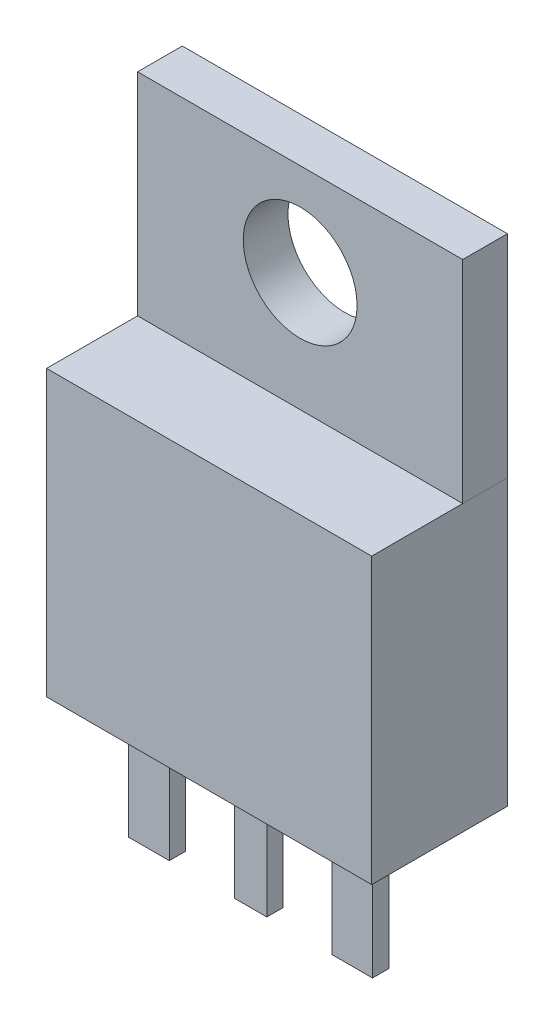
ISO-10303-21;
HEADER;
FILE_DESCRIPTION(('STEP AP214'),'2;1');
FILE_NAME('part.step','',(''),(''),'','','');
FILE_SCHEMA(('AUTOMOTIVE_DESIGN { 1 0 10303 214 1 1 1 1 }'));
ENDSEC;
DATA;
#1=APPLICATION_CONTEXT('core data for automotive mechanical design processes');
#2=APPLICATION_PROTOCOL_DEFINITION('international standard','automotive_design',2000,#1);
#3=PRODUCT_CONTEXT('',#1,'mechanical');
#4=PRODUCT('Part','Part','',(#3));
#5=PRODUCT_RELATED_PRODUCT_CATEGORY('part','',(#4));
#6=PRODUCT_DEFINITION_FORMATION('','',#4);
#7=PRODUCT_DEFINITION_CONTEXT('part definition',#1,'design');
#8=PRODUCT_DEFINITION('design','',#6,#7);
#9=PRODUCT_DEFINITION_SHAPE('','',#8);
#10=(LENGTH_UNIT() NAMED_UNIT(*) SI_UNIT(.MILLI.,.METRE.));
#11=(NAMED_UNIT(*) PLANE_ANGLE_UNIT() SI_UNIT($,.RADIAN.));
#12=(NAMED_UNIT(*) SI_UNIT($,.STERADIAN.) SOLID_ANGLE_UNIT());
#13=UNCERTAINTY_MEASURE_WITH_UNIT(LENGTH_MEASURE(1.E-05),#10,'distance_accuracy_value','');
#14=(GEOMETRIC_REPRESENTATION_CONTEXT(3) GLOBAL_UNCERTAINTY_ASSIGNED_CONTEXT((#13)) GLOBAL_UNIT_ASSIGNED_CONTEXT((#10,
#11,#12)) REPRESENTATION_CONTEXT('',''));
#15=CARTESIAN_POINT('',(0.,0.,0.));
#16=DIRECTION('',(0.,0.,1.));
#17=DIRECTION('',(1.,0.,0.));
#18=AXIS2_PLACEMENT_3D('',#15,#16,#17);
#19=CARTESIAN_POINT('',(0.508000000000001,-16.002,2.9464));
#20=DIRECTION('',(-1.,0.,0.));
#21=DIRECTION('',(0.,0.,1.));
#22=AXIS2_PLACEMENT_3D('',#19,#20,#21);
#23=PLANE('',#22);
#24=DIRECTION('',(0.,0.,1.));
#25=VECTOR('',#24,1.);
#26=CARTESIAN_POINT('',(0.508000000000001,-12.192,2.9464));
#27=LINE('',#26,#25);
#28=CARTESIAN_POINT('',(0.508000000000001,-12.192,2.4384));
#29=VERTEX_POINT('',#28);
#30=CARTESIAN_POINT('',(0.508000000000001,-12.192,2.9464));
#31=VERTEX_POINT('',#30);
#32=EDGE_CURVE('E111',#29,#31,#27,.T.);
#33=ORIENTED_EDGE('',*,*,#32,.T.);
#34=DIRECTION('',(0.,1.,0.));
#35=VECTOR('',#34,1.);
#36=CARTESIAN_POINT('',(0.508000000000001,-16.002,2.9464));
#37=LINE('',#36,#35);
#38=CARTESIAN_POINT('',(0.508000000000001,-16.002,2.9464));
#39=VERTEX_POINT('',#38);
#40=EDGE_CURVE('E12',#39,#31,#37,.T.);
#41=ORIENTED_EDGE('',*,*,#40,.F.);
#42=DIRECTION('',(0.,0.,1.));
#43=VECTOR('',#42,1.);
#44=CARTESIAN_POINT('',(0.508000000000001,-16.002,2.9464));
#45=LINE('',#44,#43);
#46=CARTESIAN_POINT('',(0.508000000000001,-16.002,2.4384));
#47=VERTEX_POINT('',#46);
#48=EDGE_CURVE('E99',#47,#39,#45,.T.);
#49=ORIENTED_EDGE('',*,*,#48,.F.);
#50=DIRECTION('',(0.,1.,0.));
#51=VECTOR('',#50,1.);
#52=CARTESIAN_POINT('',(0.508000000000001,-16.002,2.4384));
#53=LINE('',#52,#51);
#54=EDGE_CURVE('E107',#47,#29,#53,.T.);
#55=ORIENTED_EDGE('',*,*,#54,.T.);
#56=EDGE_LOOP('',(#33,#41,#49,#55));
#57=FACE_BOUND('',#56,.T.);
#58=ADVANCED_FACE('F48',(#57),#23,.F.);
#59=CARTESIAN_POINT('',(-0.507999999999999,-16.002,2.9464));
#60=DIRECTION('',(0.,0.,-1.));
#61=DIRECTION('',(-1.,0.,0.));
#62=AXIS2_PLACEMENT_3D('',#59,#60,#61);
#63=PLANE('',#62);
#64=DIRECTION('',(-1.,0.,0.));
#65=VECTOR('',#64,1.);
#66=CARTESIAN_POINT('',(-0.507999999999999,-12.192,2.9464));
#67=LINE('',#66,#65);
#68=CARTESIAN_POINT('',(-0.507999999999999,-12.192,2.9464));
#69=VERTEX_POINT('',#68);
#70=EDGE_CURVE('E103',#31,#69,#67,.T.);
#71=ORIENTED_EDGE('',*,*,#70,.T.);
#72=DIRECTION('',(0.,1.,0.));
#73=VECTOR('',#72,1.);
#74=CARTESIAN_POINT('',(-0.507999999999999,-16.002,2.9464));
#75=LINE('',#74,#73);
#76=CARTESIAN_POINT('',(-0.507999999999999,-16.002,2.9464));
#77=VERTEX_POINT('',#76);
#78=EDGE_CURVE('E56',#77,#69,#75,.T.);
#79=ORIENTED_EDGE('',*,*,#78,.F.);
#80=DIRECTION('',(-1.,0.,0.));
#81=VECTOR('',#80,1.);
#82=CARTESIAN_POINT('',(-0.507999999999999,-16.002,2.9464));
#83=LINE('',#82,#81);
#84=EDGE_CURVE('E94',#39,#77,#83,.T.);
#85=ORIENTED_EDGE('',*,*,#84,.F.);
#86=ORIENTED_EDGE('',*,*,#40,.T.);
#87=EDGE_LOOP('',(#71,#79,#85,#86));
#88=FACE_BOUND('',#87,.T.);
#89=ADVANCED_FACE('F102',(#88),#63,.F.);
#90=CARTESIAN_POINT('',(-0.507999999999999,-16.002,2.9464));
#91=DIRECTION('',(1.,0.,0.));
#92=DIRECTION('',(0.,0.,-1.));
#93=AXIS2_PLACEMENT_3D('',#90,#91,#92);
#94=PLANE('',#93);
#95=DIRECTION('',(0.,0.,-1.));
#96=VECTOR('',#95,1.);
#97=CARTESIAN_POINT('',(-0.507999999999999,-12.192,2.9464));
#98=LINE('',#97,#96);
#99=CARTESIAN_POINT('',(-0.507999999999999,-12.192,2.4384));
#100=VERTEX_POINT('',#99);
#101=EDGE_CURVE('E81',#69,#100,#98,.T.);
#102=ORIENTED_EDGE('',*,*,#101,.T.);
#103=DIRECTION('',(0.,1.,0.));
#104=VECTOR('',#103,1.);
#105=CARTESIAN_POINT('',(-0.507999999999999,-16.002,2.4384));
#106=LINE('',#105,#104);
#107=CARTESIAN_POINT('',(-0.507999999999999,-16.002,2.4384));
#108=VERTEX_POINT('',#107);
#109=EDGE_CURVE('E104',#108,#100,#106,.T.);
#110=ORIENTED_EDGE('',*,*,#109,.F.);
#111=DIRECTION('',(0.,0.,-1.));
#112=VECTOR('',#111,1.);
#113=CARTESIAN_POINT('',(-0.507999999999999,-16.002,2.9464));
#114=LINE('',#113,#112);
#115=EDGE_CURVE('E97',#77,#108,#114,.T.);
#116=ORIENTED_EDGE('',*,*,#115,.F.);
#117=ORIENTED_EDGE('',*,*,#78,.T.);
#118=EDGE_LOOP('',(#102,#110,#116,#117));
#119=FACE_BOUND('',#118,.T.);
#120=ADVANCED_FACE('F105',(#119),#94,.F.);
#121=CARTESIAN_POINT('',(-0.507999999999999,-16.002,2.4384));
#122=DIRECTION('',(0.,0.,1.));
#123=DIRECTION('',(1.,0.,0.));
#124=AXIS2_PLACEMENT_3D('',#121,#122,#123);
#125=PLANE('',#124);
#126=DIRECTION('',(1.,0.,0.));
#127=VECTOR('',#126,1.);
#128=CARTESIAN_POINT('',(-0.507999999999999,-12.192,2.4384));
#129=LINE('',#128,#127);
#130=EDGE_CURVE('E87',#100,#29,#129,.T.);
#131=ORIENTED_EDGE('',*,*,#130,.T.);
#132=ORIENTED_EDGE('',*,*,#54,.F.);
#133=DIRECTION('',(1.,0.,0.));
#134=VECTOR('',#133,1.);
#135=CARTESIAN_POINT('',(-0.507999999999999,-16.002,2.4384));
#136=LINE('',#135,#134);
#137=EDGE_CURVE('E64',#108,#47,#136,.T.);
#138=ORIENTED_EDGE('',*,*,#137,.F.);
#139=ORIENTED_EDGE('',*,*,#109,.T.);
#140=EDGE_LOOP('',(#131,#132,#138,#139));
#141=FACE_BOUND('',#140,.T.);
#142=ADVANCED_FACE('F118',(#141),#125,.F.);
#143=CARTESIAN_POINT('',(0.,-16.002,0.));
#144=DIRECTION('',(0.,-1.,0.));
#145=DIRECTION('',(0.,0.,-1.));
#146=AXIS2_PLACEMENT_3D('',#143,#144,#145);
#147=PLANE('',#146);
#148=ORIENTED_EDGE('',*,*,#48,.T.);
#149=ORIENTED_EDGE('',*,*,#84,.T.);
#150=ORIENTED_EDGE('',*,*,#115,.T.);
#151=ORIENTED_EDGE('',*,*,#137,.T.);
#152=EDGE_LOOP('',(#148,#149,#150,#151));
#153=FACE_BOUND('',#152,.T.);
#154=ADVANCED_FACE('F95',(#153),#147,.T.);
#155=CARTESIAN_POINT('',(0.,-12.192,0.));
#156=DIRECTION('',(0.,-1.,0.));
#157=DIRECTION('',(0.,0.,-1.));
#158=AXIS2_PLACEMENT_3D('',#155,#156,#157);
#159=PLANE('',#158);
#160=ORIENTED_EDGE('',*,*,#32,.F.);
#161=ORIENTED_EDGE('',*,*,#130,.F.);
#162=ORIENTED_EDGE('',*,*,#101,.F.);
#163=ORIENTED_EDGE('',*,*,#70,.F.);
#164=EDGE_LOOP('',(#160,#161,#162,#163));
#165=FACE_BOUND('',#164,.T.);
#166=ADVANCED_FACE('F121',(#165),#159,.F.);
#167=CLOSED_SHELL('',(#58,#89,#120,#142,#154,#166));
#168=MANIFOLD_SOLID_BREP('B2',#167);
#169=CARTESIAN_POINT('',(3.81,-16.002,2.9464));
#170=DIRECTION('',(-1.,0.,0.));
#171=DIRECTION('',(0.,0.,1.));
#172=AXIS2_PLACEMENT_3D('',#169,#170,#171);
#173=PLANE('',#172);
#174=DIRECTION('',(0.,0.,1.));
#175=VECTOR('',#174,1.);
#176=CARTESIAN_POINT('',(3.81,-12.192,2.9464));
#177=LINE('',#176,#175);
#178=CARTESIAN_POINT('',(3.81,-12.192,2.4384));
#179=VERTEX_POINT('',#178);
#180=CARTESIAN_POINT('',(3.81,-12.192,2.9464));
#181=VERTEX_POINT('',#180);
#182=EDGE_CURVE('E245',#179,#181,#177,.T.);
#183=ORIENTED_EDGE('',*,*,#182,.T.);
#184=DIRECTION('',(0.,1.,0.));
#185=VECTOR('',#184,1.);
#186=CARTESIAN_POINT('',(3.81,-16.002,2.9464));
#187=LINE('',#186,#185);
#188=CARTESIAN_POINT('',(3.81,-16.002,2.9464));
#189=VERTEX_POINT('',#188);
#190=EDGE_CURVE('E46',#189,#181,#187,.T.);
#191=ORIENTED_EDGE('',*,*,#190,.F.);
#192=DIRECTION('',(0.,0.,1.));
#193=VECTOR('',#192,1.);
#194=CARTESIAN_POINT('',(3.81,-16.002,2.9464));
#195=LINE('',#194,#193);
#196=CARTESIAN_POINT('',(3.81,-16.002,2.4384));
#197=VERTEX_POINT('',#196);
#198=EDGE_CURVE('E233',#197,#189,#195,.T.);
#199=ORIENTED_EDGE('',*,*,#198,.F.);
#200=DIRECTION('',(0.,1.,0.));
#201=VECTOR('',#200,1.);
#202=CARTESIAN_POINT('',(3.81,-16.002,2.4384));
#203=LINE('',#202,#201);
#204=EDGE_CURVE('E241',#197,#179,#203,.T.);
#205=ORIENTED_EDGE('',*,*,#204,.T.);
#206=EDGE_LOOP('',(#183,#191,#199,#205));
#207=FACE_BOUND('',#206,.T.);
#208=ADVANCED_FACE('F182',(#207),#173,.F.);
#209=CARTESIAN_POINT('',(2.54,-16.002,2.9464));
#210=DIRECTION('',(0.,0.,-1.));
#211=DIRECTION('',(-1.,0.,0.));
#212=AXIS2_PLACEMENT_3D('',#209,#210,#211);
#213=PLANE('',#212);
#214=DIRECTION('',(-1.,0.,0.));
#215=VECTOR('',#214,1.);
#216=CARTESIAN_POINT('',(2.54,-12.192,2.9464));
#217=LINE('',#216,#215);
#218=CARTESIAN_POINT('',(2.54,-12.192,2.9464));
#219=VERTEX_POINT('',#218);
#220=EDGE_CURVE('E237',#181,#219,#217,.T.);
#221=ORIENTED_EDGE('',*,*,#220,.T.);
#222=DIRECTION('',(0.,1.,0.));
#223=VECTOR('',#222,1.);
#224=CARTESIAN_POINT('',(2.54,-16.002,2.9464));
#225=LINE('',#224,#223);
#226=CARTESIAN_POINT('',(2.54,-16.002,2.9464));
#227=VERTEX_POINT('',#226);
#228=EDGE_CURVE('E190',#227,#219,#225,.T.);
#229=ORIENTED_EDGE('',*,*,#228,.F.);
#230=DIRECTION('',(-1.,0.,0.));
#231=VECTOR('',#230,1.);
#232=CARTESIAN_POINT('',(2.54,-16.002,2.9464));
#233=LINE('',#232,#231);
#234=EDGE_CURVE('E228',#189,#227,#233,.T.);
#235=ORIENTED_EDGE('',*,*,#234,.F.);
#236=ORIENTED_EDGE('',*,*,#190,.T.);
#237=EDGE_LOOP('',(#221,#229,#235,#236));
#238=FACE_BOUND('',#237,.T.);
#239=ADVANCED_FACE('F236',(#238),#213,.F.);
#240=CARTESIAN_POINT('',(2.54,-16.002,2.9464));
#241=DIRECTION('',(1.,0.,0.));
#242=DIRECTION('',(0.,0.,-1.));
#243=AXIS2_PLACEMENT_3D('',#240,#241,#242);
#244=PLANE('',#243);
#245=DIRECTION('',(0.,0.,-1.));
#246=VECTOR('',#245,1.);
#247=CARTESIAN_POINT('',(2.54,-12.192,2.9464));
#248=LINE('',#247,#246);
#249=CARTESIAN_POINT('',(2.54,-12.192,2.4384));
#250=VERTEX_POINT('',#249);
#251=EDGE_CURVE('E215',#219,#250,#248,.T.);
#252=ORIENTED_EDGE('',*,*,#251,.T.);
#253=DIRECTION('',(0.,1.,0.));
#254=VECTOR('',#253,1.);
#255=CARTESIAN_POINT('',(2.54,-16.002,2.4384));
#256=LINE('',#255,#254);
#257=CARTESIAN_POINT('',(2.54,-16.002,2.4384));
#258=VERTEX_POINT('',#257);
#259=EDGE_CURVE('E238',#258,#250,#256,.T.);
#260=ORIENTED_EDGE('',*,*,#259,.F.);
#261=DIRECTION('',(0.,0.,-1.));
#262=VECTOR('',#261,1.);
#263=CARTESIAN_POINT('',(2.54,-16.002,2.9464));
#264=LINE('',#263,#262);
#265=EDGE_CURVE('E231',#227,#258,#264,.T.);
#266=ORIENTED_EDGE('',*,*,#265,.F.);
#267=ORIENTED_EDGE('',*,*,#228,.T.);
#268=EDGE_LOOP('',(#252,#260,#266,#267));
#269=FACE_BOUND('',#268,.T.);
#270=ADVANCED_FACE('F239',(#269),#244,.F.);
#271=CARTESIAN_POINT('',(2.54,-16.002,2.4384));
#272=DIRECTION('',(0.,0.,1.));
#273=DIRECTION('',(1.,0.,0.));
#274=AXIS2_PLACEMENT_3D('',#271,#272,#273);
#275=PLANE('',#274);
#276=DIRECTION('',(1.,0.,0.));
#277=VECTOR('',#276,1.);
#278=CARTESIAN_POINT('',(2.54,-12.192,2.4384));
#279=LINE('',#278,#277);
#280=EDGE_CURVE('E221',#250,#179,#279,.T.);
#281=ORIENTED_EDGE('',*,*,#280,.T.);
#282=ORIENTED_EDGE('',*,*,#204,.F.);
#283=DIRECTION('',(1.,0.,0.));
#284=VECTOR('',#283,1.);
#285=CARTESIAN_POINT('',(2.54,-16.002,2.4384));
#286=LINE('',#285,#284);
#287=EDGE_CURVE('E198',#258,#197,#286,.T.);
#288=ORIENTED_EDGE('',*,*,#287,.F.);
#289=ORIENTED_EDGE('',*,*,#259,.T.);
#290=EDGE_LOOP('',(#281,#282,#288,#289));
#291=FACE_BOUND('',#290,.T.);
#292=ADVANCED_FACE('F252',(#291),#275,.F.);
#293=CARTESIAN_POINT('',(0.,-16.002,0.));
#294=DIRECTION('',(0.,-1.,0.));
#295=DIRECTION('',(0.,0.,-1.));
#296=AXIS2_PLACEMENT_3D('',#293,#294,#295);
#297=PLANE('',#296);
#298=ORIENTED_EDGE('',*,*,#198,.T.);
#299=ORIENTED_EDGE('',*,*,#234,.T.);
#300=ORIENTED_EDGE('',*,*,#265,.T.);
#301=ORIENTED_EDGE('',*,*,#287,.T.);
#302=EDGE_LOOP('',(#298,#299,#300,#301));
#303=FACE_BOUND('',#302,.T.);
#304=ADVANCED_FACE('F229',(#303),#297,.T.);
#305=CARTESIAN_POINT('',(0.,-12.192,0.));
#306=DIRECTION('',(0.,-1.,0.));
#307=DIRECTION('',(0.,0.,-1.));
#308=AXIS2_PLACEMENT_3D('',#305,#306,#307);
#309=PLANE('',#308);
#310=ORIENTED_EDGE('',*,*,#182,.F.);
#311=ORIENTED_EDGE('',*,*,#280,.F.);
#312=ORIENTED_EDGE('',*,*,#251,.F.);
#313=ORIENTED_EDGE('',*,*,#220,.F.);
#314=EDGE_LOOP('',(#310,#311,#312,#313));
#315=FACE_BOUND('',#314,.T.);
#316=ADVANCED_FACE('F255',(#315),#309,.F.);
#317=CLOSED_SHELL('',(#208,#239,#270,#292,#304,#316));
#318=MANIFOLD_SOLID_BREP('B6',#317);
#319=CARTESIAN_POINT('',(-2.54,-16.002,2.9464));
#320=DIRECTION('',(-1.,0.,0.));
#321=DIRECTION('',(0.,0.,1.));
#322=AXIS2_PLACEMENT_3D('',#319,#320,#321);
#323=PLANE('',#322);
#324=DIRECTION('',(0.,0.,1.));
#325=VECTOR('',#324,1.);
#326=CARTESIAN_POINT('',(-2.54,-12.192,2.9464));
#327=LINE('',#326,#325);
#328=CARTESIAN_POINT('',(-2.54,-12.192,2.4384));
#329=VERTEX_POINT('',#328);
#330=CARTESIAN_POINT('',(-2.54,-12.192,2.9464));
#331=VERTEX_POINT('',#330);
#332=EDGE_CURVE('E379',#329,#331,#327,.T.);
#333=ORIENTED_EDGE('',*,*,#332,.T.);
#334=DIRECTION('',(0.,1.,0.));
#335=VECTOR('',#334,1.);
#336=CARTESIAN_POINT('',(-2.54,-16.002,2.9464));
#337=LINE('',#336,#335);
#338=CARTESIAN_POINT('',(-2.54,-16.002,2.9464));
#339=VERTEX_POINT('',#338);
#340=EDGE_CURVE('E180',#339,#331,#337,.T.);
#341=ORIENTED_EDGE('',*,*,#340,.F.);
#342=DIRECTION('',(0.,0.,1.));
#343=VECTOR('',#342,1.);
#344=CARTESIAN_POINT('',(-2.54,-16.002,2.9464));
#345=LINE('',#344,#343);
#346=CARTESIAN_POINT('',(-2.54,-16.002,2.4384));
#347=VERTEX_POINT('',#346);
#348=EDGE_CURVE('E367',#347,#339,#345,.T.);
#349=ORIENTED_EDGE('',*,*,#348,.F.);
#350=DIRECTION('',(0.,1.,0.));
#351=VECTOR('',#350,1.);
#352=CARTESIAN_POINT('',(-2.54,-16.002,2.4384));
#353=LINE('',#352,#351);
#354=EDGE_CURVE('E375',#347,#329,#353,.T.);
#355=ORIENTED_EDGE('',*,*,#354,.T.);
#356=EDGE_LOOP('',(#333,#341,#349,#355));
#357=FACE_BOUND('',#356,.T.);
#358=ADVANCED_FACE('F316',(#357),#323,.F.);
#359=CARTESIAN_POINT('',(-3.81,-16.002,2.9464));
#360=DIRECTION('',(0.,0.,-1.));
#361=DIRECTION('',(-1.,0.,0.));
#362=AXIS2_PLACEMENT_3D('',#359,#360,#361);
#363=PLANE('',#362);
#364=DIRECTION('',(-1.,0.,0.));
#365=VECTOR('',#364,1.);
#366=CARTESIAN_POINT('',(-3.81,-12.192,2.9464));
#367=LINE('',#366,#365);
#368=CARTESIAN_POINT('',(-3.81,-12.192,2.9464));
#369=VERTEX_POINT('',#368);
#370=EDGE_CURVE('E371',#331,#369,#367,.T.);
#371=ORIENTED_EDGE('',*,*,#370,.T.);
#372=DIRECTION('',(0.,1.,0.));
#373=VECTOR('',#372,1.);
#374=CARTESIAN_POINT('',(-3.81,-16.002,2.9464));
#375=LINE('',#374,#373);
#376=CARTESIAN_POINT('',(-3.81,-16.002,2.9464));
#377=VERTEX_POINT('',#376);
#378=EDGE_CURVE('E324',#377,#369,#375,.T.);
#379=ORIENTED_EDGE('',*,*,#378,.F.);
#380=DIRECTION('',(-1.,0.,0.));
#381=VECTOR('',#380,1.);
#382=CARTESIAN_POINT('',(-3.81,-16.002,2.9464));
#383=LINE('',#382,#381);
#384=EDGE_CURVE('E362',#339,#377,#383,.T.);
#385=ORIENTED_EDGE('',*,*,#384,.F.);
#386=ORIENTED_EDGE('',*,*,#340,.T.);
#387=EDGE_LOOP('',(#371,#379,#385,#386));
#388=FACE_BOUND('',#387,.T.);
#389=ADVANCED_FACE('F370',(#388),#363,.F.);
#390=CARTESIAN_POINT('',(-3.81,-16.002,2.9464));
#391=DIRECTION('',(1.,0.,0.));
#392=DIRECTION('',(0.,0.,-1.));
#393=AXIS2_PLACEMENT_3D('',#390,#391,#392);
#394=PLANE('',#393);
#395=DIRECTION('',(0.,0.,-1.));
#396=VECTOR('',#395,1.);
#397=CARTESIAN_POINT('',(-3.81,-12.192,2.9464));
#398=LINE('',#397,#396);
#399=CARTESIAN_POINT('',(-3.81,-12.192,2.4384));
#400=VERTEX_POINT('',#399);
#401=EDGE_CURVE('E349',#369,#400,#398,.T.);
#402=ORIENTED_EDGE('',*,*,#401,.T.);
#403=DIRECTION('',(0.,1.,0.));
#404=VECTOR('',#403,1.);
#405=CARTESIAN_POINT('',(-3.81,-16.002,2.4384));
#406=LINE('',#405,#404);
#407=CARTESIAN_POINT('',(-3.81,-16.002,2.4384));
#408=VERTEX_POINT('',#407);
#409=EDGE_CURVE('E372',#408,#400,#406,.T.);
#410=ORIENTED_EDGE('',*,*,#409,.F.);
#411=DIRECTION('',(0.,0.,-1.));
#412=VECTOR('',#411,1.);
#413=CARTESIAN_POINT('',(-3.81,-16.002,2.9464));
#414=LINE('',#413,#412);
#415=EDGE_CURVE('E365',#377,#408,#414,.T.);
#416=ORIENTED_EDGE('',*,*,#415,.F.);
#417=ORIENTED_EDGE('',*,*,#378,.T.);
#418=EDGE_LOOP('',(#402,#410,#416,#417));
#419=FACE_BOUND('',#418,.T.);
#420=ADVANCED_FACE('F373',(#419),#394,.F.);
#421=CARTESIAN_POINT('',(-3.81,-16.002,2.4384));
#422=DIRECTION('',(0.,0.,1.));
#423=DIRECTION('',(1.,0.,0.));
#424=AXIS2_PLACEMENT_3D('',#421,#422,#423);
#425=PLANE('',#424);
#426=DIRECTION('',(1.,0.,0.));
#427=VECTOR('',#426,1.);
#428=CARTESIAN_POINT('',(-3.81,-12.192,2.4384));
#429=LINE('',#428,#427);
#430=EDGE_CURVE('E355',#400,#329,#429,.T.);
#431=ORIENTED_EDGE('',*,*,#430,.T.);
#432=ORIENTED_EDGE('',*,*,#354,.F.);
#433=DIRECTION('',(1.,0.,0.));
#434=VECTOR('',#433,1.);
#435=CARTESIAN_POINT('',(-3.81,-16.002,2.4384));
#436=LINE('',#435,#434);
#437=EDGE_CURVE('E332',#408,#347,#436,.T.);
#438=ORIENTED_EDGE('',*,*,#437,.F.);
#439=ORIENTED_EDGE('',*,*,#409,.T.);
#440=EDGE_LOOP('',(#431,#432,#438,#439));
#441=FACE_BOUND('',#440,.T.);
#442=ADVANCED_FACE('F386',(#441),#425,.F.);
#443=CARTESIAN_POINT('',(0.,-16.002,0.));
#444=DIRECTION('',(0.,-1.,0.));
#445=DIRECTION('',(0.,0.,-1.));
#446=AXIS2_PLACEMENT_3D('',#443,#444,#445);
#447=PLANE('',#446);
#448=ORIENTED_EDGE('',*,*,#348,.T.);
#449=ORIENTED_EDGE('',*,*,#384,.T.);
#450=ORIENTED_EDGE('',*,*,#415,.T.);
#451=ORIENTED_EDGE('',*,*,#437,.T.);
#452=EDGE_LOOP('',(#448,#449,#450,#451));
#453=FACE_BOUND('',#452,.T.);
#454=ADVANCED_FACE('F363',(#453),#447,.T.);
#455=CARTESIAN_POINT('',(0.,-12.192,0.));
#456=DIRECTION('',(0.,-1.,0.));
#457=DIRECTION('',(0.,0.,-1.));
#458=AXIS2_PLACEMENT_3D('',#455,#456,#457);
#459=PLANE('',#458);
#460=ORIENTED_EDGE('',*,*,#332,.F.);
#461=ORIENTED_EDGE('',*,*,#430,.F.);
#462=ORIENTED_EDGE('',*,*,#401,.F.);
#463=ORIENTED_EDGE('',*,*,#370,.F.);
#464=EDGE_LOOP('',(#460,#461,#462,#463));
#465=FACE_BOUND('',#464,.T.);
#466=ADVANCED_FACE('F389',(#465),#459,.F.);
#467=CLOSED_SHELL('',(#358,#389,#420,#442,#454,#466));
#468=MANIFOLD_SOLID_BREP('B40',#467);
#469=CARTESIAN_POINT('',(5.08,-3.302,4.2418));
#470=DIRECTION('',(-1.,0.,0.));
#471=DIRECTION('',(0.,0.,1.));
#472=AXIS2_PLACEMENT_3D('',#469,#470,#471);
#473=PLANE('',#472);
#474=DIRECTION('',(0.,1.,0.));
#475=VECTOR('',#474,1.);
#476=CARTESIAN_POINT('',(5.08,-3.302,0.));
#477=LINE('',#476,#475);
#478=CARTESIAN_POINT('',(5.08,-12.192,0.));
#479=VERTEX_POINT('',#478);
#480=CARTESIAN_POINT('',(5.08,-3.302,0.));
#481=VERTEX_POINT('',#480);
#482=EDGE_CURVE('E553',#479,#481,#477,.T.);
#483=ORIENTED_EDGE('',*,*,#482,.T.);
#484=DIRECTION('',(0.,0.,-1.));
#485=VECTOR('',#484,1.);
#486=CARTESIAN_POINT('',(5.08,-3.302,4.2418));
#487=LINE('',#486,#485);
#488=CARTESIAN_POINT('',(5.08,-3.302,4.2418));
#489=VERTEX_POINT('',#488);
#490=EDGE_CURVE('E314',#489,#481,#487,.T.);
#491=ORIENTED_EDGE('',*,*,#490,.F.);
#492=DIRECTION('',(0.,1.,0.));
#493=VECTOR('',#492,1.);
#494=CARTESIAN_POINT('',(5.08,-3.302,4.2418));
#495=LINE('',#494,#493);
#496=CARTESIAN_POINT('',(5.08,-12.192,4.2418));
#497=VERTEX_POINT('',#496);
#498=EDGE_CURVE('E558',#497,#489,#495,.T.);
#499=ORIENTED_EDGE('',*,*,#498,.F.);
#500=DIRECTION('',(0.,0.,-1.));
#501=VECTOR('',#500,1.);
#502=CARTESIAN_POINT('',(5.08,-12.192,4.2418));
#503=LINE('',#502,#501);
#504=EDGE_CURVE('E564',#497,#479,#503,.T.);
#505=ORIENTED_EDGE('',*,*,#504,.T.);
#506=EDGE_LOOP('',(#483,#491,#499,#505));
#507=FACE_BOUND('',#506,.T.);
#508=ADVANCED_FACE('F449',(#507),#473,.F.);
#509=CARTESIAN_POINT('',(-5.08,-3.302,4.2418));
#510=DIRECTION('',(0.,-1.,0.));
#511=DIRECTION('',(0.,0.,-1.));
#512=AXIS2_PLACEMENT_3D('',#509,#510,#511);
#513=PLANE('',#512);
#514=DIRECTION('',(-1.,0.,0.));
#515=VECTOR('',#514,1.);
#516=CARTESIAN_POINT('',(-5.08,-3.302,0.));
#517=LINE('',#516,#515);
#518=CARTESIAN_POINT('',(3.81,-3.302,0.));
#519=VERTEX_POINT('',#518);
#520=EDGE_CURVE('E568',#481,#519,#517,.T.);
#521=ORIENTED_EDGE('',*,*,#520,.T.);
#522=DIRECTION('',(0.,0.,-1.));
#523=VECTOR('',#522,1.);
#524=CARTESIAN_POINT('',(3.81,-3.302,1.397));
#525=LINE('',#524,#523);
#526=CARTESIAN_POINT('',(3.81,-3.302,1.397));
#527=VERTEX_POINT('',#526);
#528=EDGE_CURVE('E551',#527,#519,#525,.T.);
#529=ORIENTED_EDGE('',*,*,#528,.F.);
#530=DIRECTION('',(1.,0.,0.));
#531=VECTOR('',#530,1.);
#532=CARTESIAN_POINT('',(3.81,-3.302,1.397));
#533=LINE('',#532,#531);
#534=CARTESIAN_POINT('',(-3.81,-3.302,1.397));
#535=VERTEX_POINT('',#534);
#536=EDGE_CURVE('E529',#535,#527,#533,.T.);
#537=ORIENTED_EDGE('',*,*,#536,.F.);
#538=DIRECTION('',(0.,0.,-1.));
#539=VECTOR('',#538,1.);
#540=CARTESIAN_POINT('',(-3.81,-3.302,1.397));
#541=LINE('',#540,#539);
#542=CARTESIAN_POINT('',(-3.81,-3.302,0.));
#543=VERTEX_POINT('',#542);
#544=EDGE_CURVE('E554',#535,#543,#541,.T.);
#545=ORIENTED_EDGE('',*,*,#544,.T.);
#546=CARTESIAN_POINT('',(-5.08,-3.302,0.));
#547=VERTEX_POINT('',#546);
#548=EDGE_CURVE('E567',#543,#547,#517,.T.);
#549=ORIENTED_EDGE('',*,*,#548,.T.);
#550=DIRECTION('',(0.,0.,-1.));
#551=VECTOR('',#550,1.);
#552=CARTESIAN_POINT('',(-5.08,-3.302,4.2418));
#553=LINE('',#552,#551);
#554=CARTESIAN_POINT('',(-5.08,-3.302,4.2418));
#555=VERTEX_POINT('',#554);
#556=EDGE_CURVE('E456',#555,#547,#553,.T.);
#557=ORIENTED_EDGE('',*,*,#556,.F.);
#558=DIRECTION('',(-1.,0.,0.));
#559=VECTOR('',#558,1.);
#560=CARTESIAN_POINT('',(-5.08,-3.302,4.2418));
#561=LINE('',#560,#559);
#562=EDGE_CURVE('E500',#489,#555,#561,.T.);
#563=ORIENTED_EDGE('',*,*,#562,.F.);
#564=ORIENTED_EDGE('',*,*,#490,.T.);
#565=EDGE_LOOP('',(#521,#529,#537,#545,#549,#557,#563,#564));
#566=FACE_BOUND('',#565,.T.);
#567=ADVANCED_FACE('F599',(#566),#513,.F.);
#568=CARTESIAN_POINT('',(-5.08,-3.302,4.2418));
#569=DIRECTION('',(1.,0.,0.));
#570=DIRECTION('',(0.,1.,0.));
#571=AXIS2_PLACEMENT_3D('',#568,#569,#570);
#572=PLANE('',#571);
#573=DIRECTION('',(0.,-1.,0.));
#574=VECTOR('',#573,1.);
#575=CARTESIAN_POINT('',(-5.08,-3.302,0.));
#576=LINE('',#575,#574);
#577=CARTESIAN_POINT('',(-5.08,-12.192,0.));
#578=VERTEX_POINT('',#577);
#579=EDGE_CURVE('E571',#547,#578,#576,.T.);
#580=ORIENTED_EDGE('',*,*,#579,.T.);
#581=DIRECTION('',(0.,0.,-1.));
#582=VECTOR('',#581,1.);
#583=CARTESIAN_POINT('',(-5.08,-12.192,4.2418));
#584=LINE('',#583,#582);
#585=CARTESIAN_POINT('',(-5.08,-12.192,4.2418));
#586=VERTEX_POINT('',#585);
#587=EDGE_CURVE('E575',#586,#578,#584,.T.);
#588=ORIENTED_EDGE('',*,*,#587,.F.);
#589=DIRECTION('',(0.,-1.,0.));
#590=VECTOR('',#589,1.);
#591=CARTESIAN_POINT('',(-5.08,-3.302,4.2418));
#592=LINE('',#591,#590);
#593=EDGE_CURVE('E561',#555,#586,#592,.T.);
#594=ORIENTED_EDGE('',*,*,#593,.F.);
#595=ORIENTED_EDGE('',*,*,#556,.T.);
#596=EDGE_LOOP('',(#580,#588,#594,#595));
#597=FACE_BOUND('',#596,.T.);
#598=ADVANCED_FACE('F580',(#597),#572,.F.);
#599=CARTESIAN_POINT('',(-5.08,-12.192,4.2418));
#600=DIRECTION('',(0.,1.,0.));
#601=DIRECTION('',(0.,0.,1.));
#602=AXIS2_PLACEMENT_3D('',#599,#600,#601);
#603=PLANE('',#602);
#604=DIRECTION('',(1.,0.,0.));
#605=VECTOR('',#604,1.);
#606=CARTESIAN_POINT('',(-5.08,-12.192,0.));
#607=LINE('',#606,#605);
#608=EDGE_CURVE('E493',#578,#479,#607,.T.);
#609=ORIENTED_EDGE('',*,*,#608,.T.);
#610=ORIENTED_EDGE('',*,*,#504,.F.);
#611=DIRECTION('',(1.,0.,0.));
#612=VECTOR('',#611,1.);
#613=CARTESIAN_POINT('',(-5.08,-12.192,4.2418));
#614=LINE('',#613,#612);
#615=EDGE_CURVE('E472',#586,#497,#614,.T.);
#616=ORIENTED_EDGE('',*,*,#615,.F.);
#617=ORIENTED_EDGE('',*,*,#587,.T.);
#618=EDGE_LOOP('',(#609,#610,#616,#617));
#619=FACE_BOUND('',#618,.T.);
#620=ADVANCED_FACE('F590',(#619),#603,.F.);
#621=CARTESIAN_POINT('',(0.,0.,4.2418));
#622=DIRECTION('',(0.,0.,1.));
#623=DIRECTION('',(1.,0.,0.));
#624=AXIS2_PLACEMENT_3D('',#621,#622,#623);
#625=PLANE('',#624);
#626=ORIENTED_EDGE('',*,*,#498,.T.);
#627=ORIENTED_EDGE('',*,*,#562,.T.);
#628=ORIENTED_EDGE('',*,*,#593,.T.);
#629=ORIENTED_EDGE('',*,*,#615,.T.);
#630=EDGE_LOOP('',(#626,#627,#628,#629));
#631=FACE_BOUND('',#630,.T.);
#632=ADVANCED_FACE('F592',(#631),#625,.T.);
#633=CARTESIAN_POINT('',(0.,0.,0.));
#634=DIRECTION('',(0.,0.,1.));
#635=DIRECTION('',(1.,0.,0.));
#636=AXIS2_PLACEMENT_3D('',#633,#634,#635);
#637=PLANE('',#636);
#638=DIRECTION('',(-1.,0.,0.));
#639=VECTOR('',#638,1.);
#640=CARTESIAN_POINT('',(3.81,-9.144,0.));
#641=LINE('',#640,#639);
#642=CARTESIAN_POINT('',(3.81,-9.144,0.));
#643=VERTEX_POINT('',#642);
#644=CARTESIAN_POINT('',(-3.81,-9.144,0.));
#645=VERTEX_POINT('',#644);
#646=EDGE_CURVE('E544',#643,#645,#641,.T.);
#647=ORIENTED_EDGE('',*,*,#646,.F.);
#648=DIRECTION('',(0.,-1.,0.));
#649=VECTOR('',#648,1.);
#650=CARTESIAN_POINT('',(3.81,-3.302,0.));
#651=LINE('',#650,#649);
#652=EDGE_CURVE('E463',#519,#643,#651,.T.);
#653=ORIENTED_EDGE('',*,*,#652,.F.);
#654=ORIENTED_EDGE('',*,*,#520,.F.);
#655=ORIENTED_EDGE('',*,*,#482,.F.);
#656=ORIENTED_EDGE('',*,*,#608,.F.);
#657=ORIENTED_EDGE('',*,*,#579,.F.);
#658=ORIENTED_EDGE('',*,*,#548,.F.);
#659=DIRECTION('',(0.,1.,0.));
#660=VECTOR('',#659,1.);
#661=CARTESIAN_POINT('',(-3.81,-3.302,0.));
#662=LINE('',#661,#660);
#663=EDGE_CURVE('E542',#645,#543,#662,.T.);
#664=ORIENTED_EDGE('',*,*,#663,.F.);
#665=EDGE_LOOP('',(#647,#653,#654,#655,#656,#657,#658,#664));
#666=FACE_BOUND('',#665,.T.);
#667=ADVANCED_FACE('F584',(#666),#637,.F.);
#668=CARTESIAN_POINT('',(3.81,-3.302,1.397));
#669=DIRECTION('',(1.,0.,0.));
#670=DIRECTION('',(0.,0.,-1.));
#671=AXIS2_PLACEMENT_3D('',#668,#669,#670);
#672=PLANE('',#671);
#673=ORIENTED_EDGE('',*,*,#652,.T.);
#674=DIRECTION('',(0.,0.,-1.));
#675=VECTOR('',#674,1.);
#676=CARTESIAN_POINT('',(3.81,-9.144,1.397));
#677=LINE('',#676,#675);
#678=CARTESIAN_POINT('',(3.81,-9.144,1.397));
#679=VERTEX_POINT('',#678);
#680=EDGE_CURVE('E519',#679,#643,#677,.T.);
#681=ORIENTED_EDGE('',*,*,#680,.F.);
#682=DIRECTION('',(0.,-1.,0.));
#683=VECTOR('',#682,1.);
#684=CARTESIAN_POINT('',(3.81,-3.302,1.397));
#685=LINE('',#684,#683);
#686=EDGE_CURVE('E523',#527,#679,#685,.T.);
#687=ORIENTED_EDGE('',*,*,#686,.F.);
#688=ORIENTED_EDGE('',*,*,#528,.T.);
#689=EDGE_LOOP('',(#673,#681,#687,#688));
#690=FACE_BOUND('',#689,.T.);
#691=ADVANCED_FACE('F521',(#690),#672,.F.);
#692=CARTESIAN_POINT('',(-3.81,-3.302,1.397));
#693=DIRECTION('',(-1.,0.,0.));
#694=DIRECTION('',(0.,0.,1.));
#695=AXIS2_PLACEMENT_3D('',#692,#693,#694);
#696=PLANE('',#695);
#697=ORIENTED_EDGE('',*,*,#663,.T.);
#698=ORIENTED_EDGE('',*,*,#544,.F.);
#699=DIRECTION('',(0.,1.,0.));
#700=VECTOR('',#699,1.);
#701=CARTESIAN_POINT('',(-3.81,-3.302,1.397));
#702=LINE('',#701,#700);
#703=CARTESIAN_POINT('',(-3.81,-9.144,1.397));
#704=VERTEX_POINT('',#703);
#705=EDGE_CURVE('E537',#704,#535,#702,.T.);
#706=ORIENTED_EDGE('',*,*,#705,.F.);
#707=DIRECTION('',(0.,0.,-1.));
#708=VECTOR('',#707,1.);
#709=CARTESIAN_POINT('',(-3.81,-9.144,1.397));
#710=LINE('',#709,#708);
#711=EDGE_CURVE('E528',#704,#645,#710,.T.);
#712=ORIENTED_EDGE('',*,*,#711,.T.);
#713=EDGE_LOOP('',(#697,#698,#706,#712));
#714=FACE_BOUND('',#713,.T.);
#715=ADVANCED_FACE('F609',(#714),#696,.F.);
#716=CARTESIAN_POINT('',(3.81,-9.144,1.397));
#717=DIRECTION('',(0.,-1.,0.));
#718=DIRECTION('',(0.,0.,-1.));
#719=AXIS2_PLACEMENT_3D('',#716,#717,#718);
#720=PLANE('',#719);
#721=ORIENTED_EDGE('',*,*,#646,.T.);
#722=ORIENTED_EDGE('',*,*,#711,.F.);
#723=DIRECTION('',(-1.,0.,0.));
#724=VECTOR('',#723,1.);
#725=CARTESIAN_POINT('',(3.81,-9.144,1.397));
#726=LINE('',#725,#724);
#727=EDGE_CURVE('E532',#679,#704,#726,.T.);
#728=ORIENTED_EDGE('',*,*,#727,.F.);
#729=ORIENTED_EDGE('',*,*,#680,.T.);
#730=EDGE_LOOP('',(#721,#722,#728,#729));
#731=FACE_BOUND('',#730,.T.);
#732=ADVANCED_FACE('F533',(#731),#720,.F.);
#733=CARTESIAN_POINT('',(0.,0.,1.397));
#734=DIRECTION('',(0.,0.,-1.));
#735=DIRECTION('',(-1.,0.,0.));
#736=AXIS2_PLACEMENT_3D('',#733,#734,#735);
#737=PLANE('',#736);
#738=ORIENTED_EDGE('',*,*,#686,.T.);
#739=ORIENTED_EDGE('',*,*,#727,.T.);
#740=ORIENTED_EDGE('',*,*,#705,.T.);
#741=ORIENTED_EDGE('',*,*,#536,.T.);
#742=EDGE_LOOP('',(#738,#739,#740,#741));
#743=FACE_BOUND('',#742,.T.);
#744=ADVANCED_FACE('F539',(#743),#737,.T.);
#745=CLOSED_SHELL('',(#508,#567,#598,#620,#632,#667,#691,#715,#732,#744));
#746=MANIFOLD_SOLID_BREP('B174',#745);
#747=CARTESIAN_POINT('',(5.08,0.,1.397));
#748=DIRECTION('',(1.,0.,0.));
#749=DIRECTION('',(0.,0.,-1.));
#750=AXIS2_PLACEMENT_3D('',#747,#748,#749);
#751=PLANE('',#750);
#752=DIRECTION('',(0.,-1.,0.));
#753=VECTOR('',#752,1.);
#754=CARTESIAN_POINT('',(5.08,0.,0.));
#755=LINE('',#754,#753);
#756=CARTESIAN_POINT('',(5.08,3.302,0.));
#757=VERTEX_POINT('',#756);
#758=CARTESIAN_POINT('',(5.08,-3.302,0.));
#759=VERTEX_POINT('',#758);
#760=EDGE_CURVE('E770',#757,#759,#755,.T.);
#761=ORIENTED_EDGE('',*,*,#760,.F.);
#762=DIRECTION('',(0.,0.,-1.));
#763=VECTOR('',#762,1.);
#764=CARTESIAN_POINT('',(5.08,3.302,1.397));
#765=LINE('',#764,#763);
#766=CARTESIAN_POINT('',(5.08,3.302,1.397));
#767=VERTEX_POINT('',#766);
#768=EDGE_CURVE('E447',#767,#757,#765,.T.);
#769=ORIENTED_EDGE('',*,*,#768,.F.);
#770=DIRECTION('',(0.,-1.,0.));
#771=VECTOR('',#770,1.);
#772=CARTESIAN_POINT('',(5.08,0.,1.397));
#773=LINE('',#772,#771);
#774=CARTESIAN_POINT('',(5.08,-3.302,1.397));
#775=VERTEX_POINT('',#774);
#776=EDGE_CURVE('E811',#767,#775,#773,.T.);
#777=ORIENTED_EDGE('',*,*,#776,.T.);
#778=DIRECTION('',(0.,0.,-1.));
#779=VECTOR('',#778,1.);
#780=CARTESIAN_POINT('',(5.08,-3.302,1.397));
#781=LINE('',#780,#779);
#782=EDGE_CURVE('E726',#775,#759,#781,.T.);
#783=ORIENTED_EDGE('',*,*,#782,.T.);
#784=EDGE_LOOP('',(#761,#769,#777,#783));
#785=FACE_BOUND('',#784,.T.);
#786=ADVANCED_FACE('F676',(#785),#751,.T.);
#787=CARTESIAN_POINT('',(0.,3.302,1.397));
#788=DIRECTION('',(0.,1.,0.));
#789=DIRECTION('',(0.,0.,1.));
#790=AXIS2_PLACEMENT_3D('',#787,#788,#789);
#791=PLANE('',#790);
#792=DIRECTION('',(1.,0.,0.));
#793=VECTOR('',#792,1.);
#794=CARTESIAN_POINT('',(0.,3.302,0.));
#795=LINE('',#794,#793);
#796=CARTESIAN_POINT('',(-5.08,3.302,0.));
#797=VERTEX_POINT('',#796);
#798=EDGE_CURVE('E773',#797,#757,#795,.T.);
#799=ORIENTED_EDGE('',*,*,#798,.F.);
#800=DIRECTION('',(0.,0.,-1.));
#801=VECTOR('',#800,1.);
#802=CARTESIAN_POINT('',(-5.08,3.302,1.397));
#803=LINE('',#802,#801);
#804=CARTESIAN_POINT('',(-5.08,3.302,1.397));
#805=VERTEX_POINT('',#804);
#806=EDGE_CURVE('E684',#805,#797,#803,.T.);
#807=ORIENTED_EDGE('',*,*,#806,.F.);
#808=DIRECTION('',(1.,0.,0.));
#809=VECTOR('',#808,1.);
#810=CARTESIAN_POINT('',(0.,3.302,1.397));
#811=LINE('',#810,#809);
#812=EDGE_CURVE('E810',#805,#767,#811,.T.);
#813=ORIENTED_EDGE('',*,*,#812,.T.);
#814=ORIENTED_EDGE('',*,*,#768,.T.);
#815=EDGE_LOOP('',(#799,#807,#813,#814));
#816=FACE_BOUND('',#815,.T.);
#817=ADVANCED_FACE('F809',(#816),#791,.T.);
#818=CARTESIAN_POINT('',(-5.08,0.,1.397));
#819=DIRECTION('',(1.,0.,0.));
#820=DIRECTION('',(0.,1.,0.));
#821=AXIS2_PLACEMENT_3D('',#818,#819,#820);
#822=PLANE('',#821);
#823=DIRECTION('',(0.,-1.,0.));
#824=VECTOR('',#823,1.);
#825=CARTESIAN_POINT('',(-5.08,0.,0.));
#826=LINE('',#825,#824);
#827=CARTESIAN_POINT('',(-5.08,-3.302,0.));
#828=VERTEX_POINT('',#827);
#829=EDGE_CURVE('E777',#797,#828,#826,.T.);
#830=ORIENTED_EDGE('',*,*,#829,.T.);
#831=DIRECTION('',(0.,0.,-1.));
#832=VECTOR('',#831,1.);
#833=CARTESIAN_POINT('',(-5.08,-3.302,1.397));
#834=LINE('',#833,#832);
#835=CARTESIAN_POINT('',(-5.08,-3.302,1.397));
#836=VERTEX_POINT('',#835);
#837=EDGE_CURVE('E793',#836,#828,#834,.T.);
#838=ORIENTED_EDGE('',*,*,#837,.F.);
#839=DIRECTION('',(0.,-1.,0.));
#840=VECTOR('',#839,1.);
#841=CARTESIAN_POINT('',(-5.08,0.,1.397));
#842=LINE('',#841,#840);
#843=EDGE_CURVE('E800',#805,#836,#842,.T.);
#844=ORIENTED_EDGE('',*,*,#843,.F.);
#845=ORIENTED_EDGE('',*,*,#806,.T.);
#846=EDGE_LOOP('',(#830,#838,#844,#845));
#847=FACE_BOUND('',#846,.T.);
#848=ADVANCED_FACE('F798',(#847),#822,.F.);
#849=CARTESIAN_POINT('',(0.,-3.302,1.397));
#850=DIRECTION('',(0.,1.,0.));
#851=DIRECTION('',(0.,0.,1.));
#852=AXIS2_PLACEMENT_3D('',#849,#850,#851);
#853=PLANE('',#852);
#854=DIRECTION('',(1.,0.,0.));
#855=VECTOR('',#854,1.);
#856=CARTESIAN_POINT('',(0.,-3.302,0.));
#857=LINE('',#856,#855);
#858=CARTESIAN_POINT('',(-3.81,-3.302,0.));
#859=VERTEX_POINT('',#858);
#860=EDGE_CURVE('E779',#828,#859,#857,.T.);
#861=ORIENTED_EDGE('',*,*,#860,.T.);
#862=DIRECTION('',(0.,0.,-1.));
#863=VECTOR('',#862,1.);
#864=CARTESIAN_POINT('',(-3.81,-3.302,1.397));
#865=LINE('',#864,#863);
#866=CARTESIAN_POINT('',(-3.81,-3.302,1.397));
#867=VERTEX_POINT('',#866);
#868=EDGE_CURVE('E790',#867,#859,#865,.T.);
#869=ORIENTED_EDGE('',*,*,#868,.F.);
#870=DIRECTION('',(1.,0.,0.));
#871=VECTOR('',#870,1.);
#872=CARTESIAN_POINT('',(0.,-3.302,1.397));
#873=LINE('',#872,#871);
#874=EDGE_CURVE('E767',#836,#867,#873,.T.);
#875=ORIENTED_EDGE('',*,*,#874,.F.);
#876=ORIENTED_EDGE('',*,*,#837,.T.);
#877=EDGE_LOOP('',(#861,#869,#875,#876));
#878=FACE_BOUND('',#877,.T.);
#879=ADVANCED_FACE('F821',(#878),#853,.F.);
#880=CARTESIAN_POINT('',(-3.81,0.,1.397));
#881=DIRECTION('',(1.,0.,0.));
#882=DIRECTION('',(0.,1.,0.));
#883=AXIS2_PLACEMENT_3D('',#880,#881,#882);
#884=PLANE('',#883);
#885=DIRECTION('',(0.,-1.,0.));
#886=VECTOR('',#885,1.);
#887=CARTESIAN_POINT('',(-3.81,0.,0.));
#888=LINE('',#887,#886);
#889=CARTESIAN_POINT('',(-3.81,-9.144,0.));
#890=VERTEX_POINT('',#889);
#891=EDGE_CURVE('E781',#859,#890,#888,.T.);
#892=ORIENTED_EDGE('',*,*,#891,.T.);
#893=DIRECTION('',(0.,0.,-1.));
#894=VECTOR('',#893,1.);
#895=CARTESIAN_POINT('',(-3.81,-9.144,1.397));
#896=LINE('',#895,#894);
#897=CARTESIAN_POINT('',(-3.81,-9.144,1.397));
#898=VERTEX_POINT('',#897);
#899=EDGE_CURVE('E762',#898,#890,#896,.T.);
#900=ORIENTED_EDGE('',*,*,#899,.F.);
#901=DIRECTION('',(0.,-1.,0.));
#902=VECTOR('',#901,1.);
#903=CARTESIAN_POINT('',(-3.81,0.,1.397));
#904=LINE('',#903,#902);
#905=EDGE_CURVE('E749',#867,#898,#904,.T.);
#906=ORIENTED_EDGE('',*,*,#905,.F.);
#907=ORIENTED_EDGE('',*,*,#868,.T.);
#908=EDGE_LOOP('',(#892,#900,#906,#907));
#909=FACE_BOUND('',#908,.T.);
#910=ADVANCED_FACE('F823',(#909),#884,.F.);
#911=CARTESIAN_POINT('',(0.,-9.144,1.397));
#912=DIRECTION('',(0.,1.,0.));
#913=DIRECTION('',(0.,0.,1.));
#914=AXIS2_PLACEMENT_3D('',#911,#912,#913);
#915=PLANE('',#914);
#916=DIRECTION('',(1.,0.,0.));
#917=VECTOR('',#916,1.);
#918=CARTESIAN_POINT('',(0.,-9.144,0.));
#919=LINE('',#918,#917);
#920=CARTESIAN_POINT('',(3.81,-9.144,0.));
#921=VERTEX_POINT('',#920);
#922=EDGE_CURVE('E758',#890,#921,#919,.T.);
#923=ORIENTED_EDGE('',*,*,#922,.T.);
#924=DIRECTION('',(0.,0.,-1.));
#925=VECTOR('',#924,1.);
#926=CARTESIAN_POINT('',(3.81,-9.144,1.397));
#927=LINE('',#926,#925);
#928=CARTESIAN_POINT('',(3.81,-9.144,1.397));
#929=VERTEX_POINT('',#928);
#930=EDGE_CURVE('E755',#929,#921,#927,.T.);
#931=ORIENTED_EDGE('',*,*,#930,.F.);
#932=DIRECTION('',(1.,0.,0.));
#933=VECTOR('',#932,1.);
#934=CARTESIAN_POINT('',(0.,-9.144,1.397));
#935=LINE('',#934,#933);
#936=EDGE_CURVE('E743',#898,#929,#935,.T.);
#937=ORIENTED_EDGE('',*,*,#936,.F.);
#938=ORIENTED_EDGE('',*,*,#899,.T.);
#939=EDGE_LOOP('',(#923,#931,#937,#938));
#940=FACE_BOUND('',#939,.T.);
#941=ADVANCED_FACE('F756',(#940),#915,.F.);
#942=CARTESIAN_POINT('',(3.81,0.,1.397));
#943=DIRECTION('',(1.,0.,0.));
#944=DIRECTION('',(0.,1.,0.));
#945=AXIS2_PLACEMENT_3D('',#942,#943,#944);
#946=PLANE('',#945);
#947=DIRECTION('',(0.,-1.,0.));
#948=VECTOR('',#947,1.);
#949=CARTESIAN_POINT('',(3.81,0.,0.));
#950=LINE('',#949,#948);
#951=CARTESIAN_POINT('',(3.81,-3.302,0.));
#952=VERTEX_POINT('',#951);
#953=EDGE_CURVE('E785',#952,#921,#950,.T.);
#954=ORIENTED_EDGE('',*,*,#953,.F.);
#955=DIRECTION('',(0.,0.,-1.));
#956=VECTOR('',#955,1.);
#957=CARTESIAN_POINT('',(3.81,-3.302,1.397));
#958=LINE('',#957,#956);
#959=CARTESIAN_POINT('',(3.81,-3.302,1.397));
#960=VERTEX_POINT('',#959);
#961=EDGE_CURVE('E719',#960,#952,#958,.T.);
#962=ORIENTED_EDGE('',*,*,#961,.F.);
#963=DIRECTION('',(0.,-1.,0.));
#964=VECTOR('',#963,1.);
#965=CARTESIAN_POINT('',(3.81,0.,1.397));
#966=LINE('',#965,#964);
#967=EDGE_CURVE('E747',#960,#929,#966,.T.);
#968=ORIENTED_EDGE('',*,*,#967,.T.);
#969=ORIENTED_EDGE('',*,*,#930,.T.);
#970=EDGE_LOOP('',(#954,#962,#968,#969));
#971=FACE_BOUND('',#970,.T.);
#972=ADVANCED_FACE('F764',(#971),#946,.T.);
#973=EDGE_CURVE('E782',#952,#759,#857,.T.);
#974=ORIENTED_EDGE('',*,*,#973,.T.);
#975=ORIENTED_EDGE('',*,*,#782,.F.);
#976=EDGE_CURVE('E692',#960,#775,#873,.T.);
#977=ORIENTED_EDGE('',*,*,#976,.F.);
#978=ORIENTED_EDGE('',*,*,#961,.T.);
#979=EDGE_LOOP('',(#974,#975,#977,#978));
#980=FACE_BOUND('',#979,.T.);
#981=ADVANCED_FACE('F832',(#980),#853,.F.);
#982=CARTESIAN_POINT('',(0.,0.,1.397));
#983=DIRECTION('',(0.,0.,1.));
#984=DIRECTION('',(1.,0.,0.));
#985=AXIS2_PLACEMENT_3D('',#982,#983,#984);
#986=PLANE('',#985);
#987=CARTESIAN_POINT('',(0.,0.406399999999999,1.397));
#988=DIRECTION('',(0.,0.,1.));
#989=DIRECTION('',(1.,0.,0.));
#990=AXIS2_PLACEMENT_3D('',#987,#988,#989);
#991=CIRCLE('',#990,1.778);
#992=CARTESIAN_POINT('',(1.778,0.406399999999999,1.397));
#993=VERTEX_POINT('',#992);
#994=EDGE_CURVE('E815',#993,#993,#991,.T.);
#995=ORIENTED_EDGE('',*,*,#994,.F.);
#996=EDGE_LOOP('',(#995));
#997=FACE_BOUND('',#996,.T.);
#998=ORIENTED_EDGE('',*,*,#776,.F.);
#999=ORIENTED_EDGE('',*,*,#812,.F.);
#1000=ORIENTED_EDGE('',*,*,#843,.T.);
#1001=ORIENTED_EDGE('',*,*,#874,.T.);
#1002=ORIENTED_EDGE('',*,*,#905,.T.);
#1003=ORIENTED_EDGE('',*,*,#936,.T.);
#1004=ORIENTED_EDGE('',*,*,#967,.F.);
#1005=ORIENTED_EDGE('',*,*,#976,.T.);
#1006=EDGE_LOOP('',(#998,#999,#1000,#1001,#1002,#1003,#1004,#1005));
#1007=FACE_BOUND('',#1006,.T.);
#1008=ADVANCED_FACE('F745',(#997,#1007),#986,.T.);
#1009=CARTESIAN_POINT('',(0.,0.,0.));
#1010=DIRECTION('',(0.,0.,1.));
#1011=DIRECTION('',(1.,0.,0.));
#1012=AXIS2_PLACEMENT_3D('',#1009,#1010,#1011);
#1013=PLANE('',#1012);
#1014=CARTESIAN_POINT('',(0.,0.406399999999999,0.));
#1015=DIRECTION('',(0.,0.,1.));
#1016=DIRECTION('',(1.,0.,0.));
#1017=AXIS2_PLACEMENT_3D('',#1014,#1015,#1016);
#1018=CIRCLE('',#1017,1.778);
#1019=CARTESIAN_POINT('',(1.778,0.406399999999999,0.));
#1020=VERTEX_POINT('',#1019);
#1021=EDGE_CURVE('E774',#1020,#1020,#1018,.T.);
#1022=ORIENTED_EDGE('',*,*,#1021,.T.);
#1023=EDGE_LOOP('',(#1022));
#1024=FACE_BOUND('',#1023,.T.);
#1025=ORIENTED_EDGE('',*,*,#760,.T.);
#1026=ORIENTED_EDGE('',*,*,#973,.F.);
#1027=ORIENTED_EDGE('',*,*,#953,.T.);
#1028=ORIENTED_EDGE('',*,*,#922,.F.);
#1029=ORIENTED_EDGE('',*,*,#891,.F.);
#1030=ORIENTED_EDGE('',*,*,#860,.F.);
#1031=ORIENTED_EDGE('',*,*,#829,.F.);
#1032=ORIENTED_EDGE('',*,*,#798,.T.);
#1033=EDGE_LOOP('',(#1025,#1026,#1027,#1028,#1029,#1030,#1031,#1032));
#1034=FACE_BOUND('',#1033,.T.);
#1035=ADVANCED_FACE('F807',(#1024,#1034),#1013,.F.);
#1036=CARTESIAN_POINT('',(0.,0.406399999999999,0.));
#1037=DIRECTION('',(0.,0.,1.));
#1038=DIRECTION('',(1.,0.,0.));
#1039=AXIS2_PLACEMENT_3D('',#1036,#1037,#1038);
#1040=CYLINDRICAL_SURFACE('',#1039,1.778);
#1041=ORIENTED_EDGE('',*,*,#1021,.F.);
#1042=EDGE_LOOP('',(#1041));
#1043=FACE_BOUND('',#1042,.T.);
#1044=ORIENTED_EDGE('',*,*,#994,.T.);
#1045=EDGE_LOOP('',(#1044));
#1046=FACE_BOUND('',#1045,.T.);
#1047=ADVANCED_FACE('F894',(#1043,#1046),#1040,.F.);
#1048=CLOSED_SHELL('',(#786,#817,#848,#879,#910,#941,#972,#981,#1008,#1035,#1047));
#1049=MANIFOLD_SOLID_BREP('B308',#1048);
#1050=ADVANCED_BREP_SHAPE_REPRESENTATION('',(#18,#168,#318,#468,#746,#1049),#14);
#1051=SHAPE_DEFINITION_REPRESENTATION(#9,#1050);
ENDSEC;
END-ISO-10303-21;
